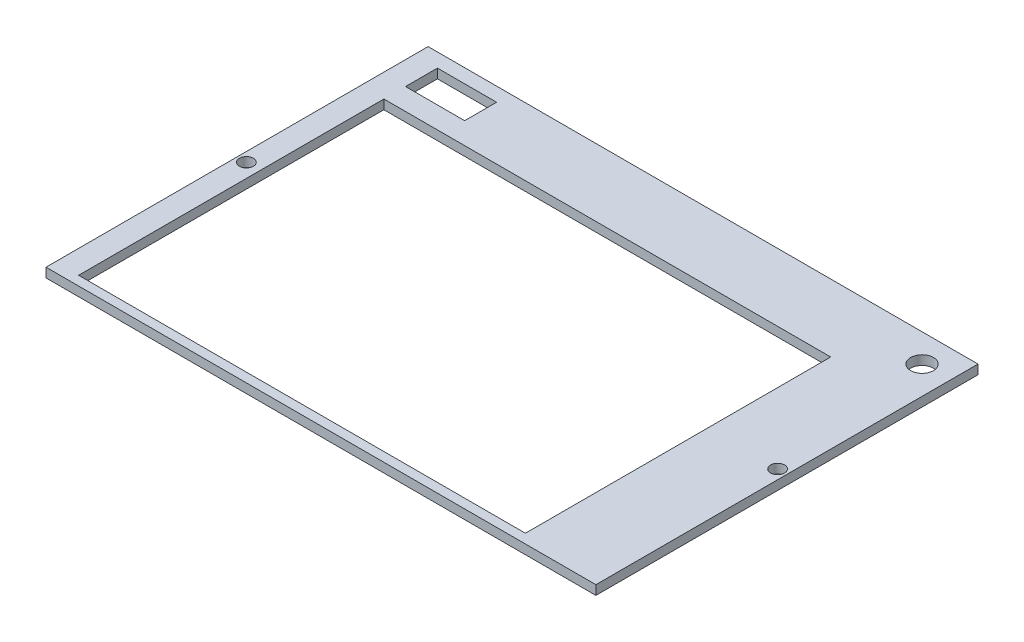
ISO-10303-21;
HEADER;
FILE_DESCRIPTION(('STEP AP214'),'2;1');
FILE_NAME('part.step','',(''),(''),'','','');
FILE_SCHEMA(('AUTOMOTIVE_DESIGN { 1 0 10303 214 1 1 1 1 }'));
ENDSEC;
DATA;
#1=APPLICATION_CONTEXT('core data for automotive mechanical design processes');
#2=APPLICATION_PROTOCOL_DEFINITION('international standard','automotive_design',2000,#1);
#3=PRODUCT_CONTEXT('',#1,'mechanical');
#4=PRODUCT('Part','Part','',(#3));
#5=PRODUCT_RELATED_PRODUCT_CATEGORY('part','',(#4));
#6=PRODUCT_DEFINITION_FORMATION('','',#4);
#7=PRODUCT_DEFINITION_CONTEXT('part definition',#1,'design');
#8=PRODUCT_DEFINITION('design','',#6,#7);
#9=PRODUCT_DEFINITION_SHAPE('','',#8);
#10=(LENGTH_UNIT() NAMED_UNIT(*) SI_UNIT(.MILLI.,.METRE.));
#11=(NAMED_UNIT(*) PLANE_ANGLE_UNIT() SI_UNIT($,.RADIAN.));
#12=(NAMED_UNIT(*) SI_UNIT($,.STERADIAN.) SOLID_ANGLE_UNIT());
#13=UNCERTAINTY_MEASURE_WITH_UNIT(LENGTH_MEASURE(1.E-05),#10,'distance_accuracy_value','');
#14=(GEOMETRIC_REPRESENTATION_CONTEXT(3) GLOBAL_UNCERTAINTY_ASSIGNED_CONTEXT((#13)) GLOBAL_UNIT_ASSIGNED_CONTEXT((#10,
#11,#12)) REPRESENTATION_CONTEXT('',''));
#15=CARTESIAN_POINT('',(0.,0.,0.));
#16=DIRECTION('',(0.,0.,1.));
#17=DIRECTION('',(1.,0.,0.));
#18=AXIS2_PLACEMENT_3D('',#15,#16,#17);
#19=CARTESIAN_POINT('',(59.,2.,41.));
#20=DIRECTION('',(-1.,0.,0.));
#21=DIRECTION('',(0.,0.,1.));
#22=AXIS2_PLACEMENT_3D('',#19,#20,#21);
#23=PLANE('',#22);
#24=DIRECTION('',(0.,0.,-1.));
#25=VECTOR('',#24,1.);
#26=CARTESIAN_POINT('',(59.,0.,41.));
#27=LINE('',#26,#25);
#28=CARTESIAN_POINT('',(59.,0.,41.));
#29=VERTEX_POINT('',#28);
#30=CARTESIAN_POINT('',(59.,0.,-41.));
#31=VERTEX_POINT('',#30);
#32=EDGE_CURVE('E215',#29,#31,#27,.T.);
#33=ORIENTED_EDGE('',*,*,#32,.T.);
#34=DIRECTION('',(0.,-1.,0.));
#35=VECTOR('',#34,1.);
#36=CARTESIAN_POINT('',(59.,2.,-41.));
#37=LINE('',#36,#35);
#38=CARTESIAN_POINT('',(59.,2.,-41.));
#39=VERTEX_POINT('',#38);
#40=EDGE_CURVE('E238',#39,#31,#37,.T.);
#41=ORIENTED_EDGE('',*,*,#40,.F.);
#42=DIRECTION('',(0.,0.,-1.));
#43=VECTOR('',#42,1.);
#44=CARTESIAN_POINT('',(59.,2.,41.));
#45=LINE('',#44,#43);
#46=CARTESIAN_POINT('',(59.,2.,41.));
#47=VERTEX_POINT('',#46);
#48=EDGE_CURVE('E200',#47,#39,#45,.T.);
#49=ORIENTED_EDGE('',*,*,#48,.F.);
#50=DIRECTION('',(0.,-1.,0.));
#51=VECTOR('',#50,1.);
#52=CARTESIAN_POINT('',(59.,2.,41.));
#53=LINE('',#52,#51);
#54=EDGE_CURVE('E214',#47,#29,#53,.T.);
#55=ORIENTED_EDGE('',*,*,#54,.T.);
#56=EDGE_LOOP('',(#33,#41,#49,#55));
#57=FACE_BOUND('',#56,.T.);
#58=ADVANCED_FACE('F39',(#57),#23,.F.);
#59=CARTESIAN_POINT('',(-59.,2.,-41.));
#60=DIRECTION('',(0.,0.,1.));
#61=DIRECTION('',(1.,0.,0.));
#62=AXIS2_PLACEMENT_3D('',#59,#60,#61);
#63=PLANE('',#62);
#64=DIRECTION('',(-1.,0.,0.));
#65=VECTOR('',#64,1.);
#66=CARTESIAN_POINT('',(-59.,0.,-41.));
#67=LINE('',#66,#65);
#68=CARTESIAN_POINT('',(-59.,0.,-41.));
#69=VERTEX_POINT('',#68);
#70=EDGE_CURVE('E219',#31,#69,#67,.T.);
#71=ORIENTED_EDGE('',*,*,#70,.T.);
#72=DIRECTION('',(0.,-1.,0.));
#73=VECTOR('',#72,1.);
#74=CARTESIAN_POINT('',(-59.,2.,-41.));
#75=LINE('',#74,#73);
#76=CARTESIAN_POINT('',(-59.,2.,-41.));
#77=VERTEX_POINT('',#76);
#78=EDGE_CURVE('E234',#77,#69,#75,.T.);
#79=ORIENTED_EDGE('',*,*,#78,.F.);
#80=DIRECTION('',(-1.,0.,0.));
#81=VECTOR('',#80,1.);
#82=CARTESIAN_POINT('',(-59.,2.,-41.));
#83=LINE('',#82,#81);
#84=EDGE_CURVE('E204',#39,#77,#83,.T.);
#85=ORIENTED_EDGE('',*,*,#84,.F.);
#86=ORIENTED_EDGE('',*,*,#40,.T.);
#87=EDGE_LOOP('',(#71,#79,#85,#86));
#88=FACE_BOUND('',#87,.T.);
#89=ADVANCED_FACE('F303',(#88),#63,.F.);
#90=CARTESIAN_POINT('',(-59.,2.,41.));
#91=DIRECTION('',(1.,0.,0.));
#92=DIRECTION('',(0.,0.,-1.));
#93=AXIS2_PLACEMENT_3D('',#90,#91,#92);
#94=PLANE('',#93);
#95=DIRECTION('',(0.,0.,1.));
#96=VECTOR('',#95,1.);
#97=CARTESIAN_POINT('',(-59.,0.,41.));
#98=LINE('',#97,#96);
#99=CARTESIAN_POINT('',(-59.,0.,41.));
#100=VERTEX_POINT('',#99);
#101=EDGE_CURVE('E222',#69,#100,#98,.T.);
#102=ORIENTED_EDGE('',*,*,#101,.T.);
#103=DIRECTION('',(0.,-1.,0.));
#104=VECTOR('',#103,1.);
#105=CARTESIAN_POINT('',(-59.,2.,41.));
#106=LINE('',#105,#104);
#107=CARTESIAN_POINT('',(-59.,2.,41.));
#108=VERTEX_POINT('',#107);
#109=EDGE_CURVE('E230',#108,#100,#106,.T.);
#110=ORIENTED_EDGE('',*,*,#109,.F.);
#111=DIRECTION('',(0.,0.,1.));
#112=VECTOR('',#111,1.);
#113=CARTESIAN_POINT('',(-59.,2.,41.));
#114=LINE('',#113,#112);
#115=EDGE_CURVE('E208',#77,#108,#114,.T.);
#116=ORIENTED_EDGE('',*,*,#115,.F.);
#117=ORIENTED_EDGE('',*,*,#78,.T.);
#118=EDGE_LOOP('',(#102,#110,#116,#117));
#119=FACE_BOUND('',#118,.T.);
#120=ADVANCED_FACE('F298',(#119),#94,.F.);
#121=CARTESIAN_POINT('',(-59.,2.,41.));
#122=DIRECTION('',(0.,0.,-1.));
#123=DIRECTION('',(-1.,0.,0.));
#124=AXIS2_PLACEMENT_3D('',#121,#122,#123);
#125=PLANE('',#124);
#126=DIRECTION('',(1.,0.,0.));
#127=VECTOR('',#126,1.);
#128=CARTESIAN_POINT('',(-59.,0.,41.));
#129=LINE('',#128,#127);
#130=EDGE_CURVE('E205',#100,#29,#129,.T.);
#131=ORIENTED_EDGE('',*,*,#130,.T.);
#132=ORIENTED_EDGE('',*,*,#54,.F.);
#133=DIRECTION('',(1.,0.,0.));
#134=VECTOR('',#133,1.);
#135=CARTESIAN_POINT('',(-59.,2.,41.));
#136=LINE('',#135,#134);
#137=EDGE_CURVE('E211',#108,#47,#136,.T.);
#138=ORIENTED_EDGE('',*,*,#137,.F.);
#139=ORIENTED_EDGE('',*,*,#109,.T.);
#140=EDGE_LOOP('',(#131,#132,#138,#139));
#141=FACE_BOUND('',#140,.T.);
#142=ADVANCED_FACE('F288',(#141),#125,.F.);
#143=CARTESIAN_POINT('',(0.,2.,0.));
#144=DIRECTION('',(0.,-1.,0.));
#145=DIRECTION('',(0.,0.,-1.));
#146=AXIS2_PLACEMENT_3D('',#143,#144,#145);
#147=PLANE('',#146);
#148=CARTESIAN_POINT('',(57.,2.,0.));
#149=DIRECTION('',(0.,1.,0.));
#150=DIRECTION('',(0.,0.,1.));
#151=AXIS2_PLACEMENT_3D('',#148,#149,#150);
#152=CIRCLE('',#151,1.5);
#153=CARTESIAN_POINT('',(57.,2.,1.5));
#154=VERTEX_POINT('',#153);
#155=EDGE_CURVE('E267',#154,#154,#152,.T.);
#156=ORIENTED_EDGE('',*,*,#155,.F.);
#157=EDGE_LOOP('',(#156));
#158=FACE_BOUND('',#157,.T.);
#159=CARTESIAN_POINT('',(-57.,2.,0.));
#160=DIRECTION('',(0.,1.,0.));
#161=DIRECTION('',(0.,0.,1.));
#162=AXIS2_PLACEMENT_3D('',#159,#160,#161);
#163=CIRCLE('',#162,1.5);
#164=CARTESIAN_POINT('',(-57.,2.,1.5));
#165=VERTEX_POINT('',#164);
#166=EDGE_CURVE('E274',#165,#165,#163,.T.);
#167=ORIENTED_EDGE('',*,*,#166,.F.);
#168=EDGE_LOOP('',(#167));
#169=FACE_BOUND('',#168,.T.);
#170=DIRECTION('',(1.,0.,0.));
#171=VECTOR('',#170,1.);
#172=CARTESIAN_POINT('',(-54.,2.,39.));
#173=LINE('',#172,#171);
#174=CARTESIAN_POINT('',(-54.,2.,39.));
#175=VERTEX_POINT('',#174);
#176=CARTESIAN_POINT('',(41.88,2.,39.));
#177=VERTEX_POINT('',#176);
#178=EDGE_CURVE('E147',#175,#177,#173,.T.);
#179=ORIENTED_EDGE('',*,*,#178,.F.);
#180=DIRECTION('',(0.,0.,1.));
#181=VECTOR('',#180,1.);
#182=CARTESIAN_POINT('',(-54.,2.,39.));
#183=LINE('',#182,#181);
#184=CARTESIAN_POINT('',(-54.,2.,-26.51));
#185=VERTEX_POINT('',#184);
#186=EDGE_CURVE('E56',#185,#175,#183,.T.);
#187=ORIENTED_EDGE('',*,*,#186,.F.);
#188=DIRECTION('',(-1.,0.,0.));
#189=VECTOR('',#188,1.);
#190=CARTESIAN_POINT('',(-54.,2.,-26.51));
#191=LINE('',#190,#189);
#192=CARTESIAN_POINT('',(41.88,2.,-26.51));
#193=VERTEX_POINT('',#192);
#194=EDGE_CURVE('E155',#193,#185,#191,.T.);
#195=ORIENTED_EDGE('',*,*,#194,.F.);
#196=DIRECTION('',(0.,0.,-1.));
#197=VECTOR('',#196,1.);
#198=CARTESIAN_POINT('',(41.88,2.,39.));
#199=LINE('',#198,#197);
#200=EDGE_CURVE('E136',#177,#193,#199,.T.);
#201=ORIENTED_EDGE('',*,*,#200,.F.);
#202=EDGE_LOOP('',(#179,#187,#195,#201));
#203=FACE_BOUND('',#202,.T.);
#204=DIRECTION('',(1.,0.,0.));
#205=VECTOR('',#204,1.);
#206=CARTESIAN_POINT('',(-54.,2.,-31.15));
#207=LINE('',#206,#205);
#208=CARTESIAN_POINT('',(-54.,2.,-31.15));
#209=VERTEX_POINT('',#208);
#210=CARTESIAN_POINT('',(-41.31,2.,-31.15));
#211=VERTEX_POINT('',#210);
#212=EDGE_CURVE('E172',#209,#211,#207,.T.);
#213=ORIENTED_EDGE('',*,*,#212,.F.);
#214=DIRECTION('',(0.,0.,1.));
#215=VECTOR('',#214,1.);
#216=CARTESIAN_POINT('',(-54.,2.,-38.));
#217=LINE('',#216,#215);
#218=CARTESIAN_POINT('',(-54.,2.,-38.));
#219=VERTEX_POINT('',#218);
#220=EDGE_CURVE('E64',#219,#209,#217,.T.);
#221=ORIENTED_EDGE('',*,*,#220,.F.);
#222=DIRECTION('',(-1.,0.,0.));
#223=VECTOR('',#222,1.);
#224=CARTESIAN_POINT('',(-54.,2.,-38.));
#225=LINE('',#224,#223);
#226=CARTESIAN_POINT('',(-41.31,2.,-38.));
#227=VERTEX_POINT('',#226);
#228=EDGE_CURVE('E181',#227,#219,#225,.T.);
#229=ORIENTED_EDGE('',*,*,#228,.F.);
#230=DIRECTION('',(0.,0.,-1.));
#231=VECTOR('',#230,1.);
#232=CARTESIAN_POINT('',(-41.31,2.,-38.));
#233=LINE('',#232,#231);
#234=EDGE_CURVE('E177',#211,#227,#233,.T.);
#235=ORIENTED_EDGE('',*,*,#234,.F.);
#236=EDGE_LOOP('',(#213,#221,#229,#235));
#237=FACE_BOUND('',#236,.T.);
#238=CARTESIAN_POINT('',(53.,2.,-35.));
#239=DIRECTION('',(0.,1.,0.));
#240=DIRECTION('',(0.,0.,1.));
#241=AXIS2_PLACEMENT_3D('',#238,#239,#240);
#242=CIRCLE('',#241,2.45);
#243=CARTESIAN_POINT('',(53.,2.,-32.55));
#244=VERTEX_POINT('',#243);
#245=EDGE_CURVE('E173',#244,#244,#242,.T.);
#246=ORIENTED_EDGE('',*,*,#245,.F.);
#247=EDGE_LOOP('',(#246));
#248=FACE_BOUND('',#247,.T.);
#249=ORIENTED_EDGE('',*,*,#48,.T.);
#250=ORIENTED_EDGE('',*,*,#84,.T.);
#251=ORIENTED_EDGE('',*,*,#115,.T.);
#252=ORIENTED_EDGE('',*,*,#137,.T.);
#253=EDGE_LOOP('',(#249,#250,#251,#252));
#254=FACE_BOUND('',#253,.T.);
#255=ADVANCED_FACE('F152',(#158,#169,#203,#237,#248,#254),#147,.F.);
#256=CARTESIAN_POINT('',(0.,0.,0.));
#257=DIRECTION('',(0.,-1.,0.));
#258=DIRECTION('',(0.,0.,-1.));
#259=AXIS2_PLACEMENT_3D('',#256,#257,#258);
#260=PLANE('',#259);
#261=CARTESIAN_POINT('',(57.,0.,0.));
#262=DIRECTION('',(0.,-1.,0.));
#263=DIRECTION('',(0.,0.,-1.));
#264=AXIS2_PLACEMENT_3D('',#261,#262,#263);
#265=CIRCLE('',#264,1.5);
#266=CARTESIAN_POINT('',(57.,0.,-1.5));
#267=VERTEX_POINT('',#266);
#268=EDGE_CURVE('E42',#267,#267,#265,.T.);
#269=ORIENTED_EDGE('',*,*,#268,.F.);
#270=EDGE_LOOP('',(#269));
#271=FACE_BOUND('',#270,.T.);
#272=CARTESIAN_POINT('',(-57.,0.,0.));
#273=DIRECTION('',(0.,-1.,0.));
#274=DIRECTION('',(0.,0.,-1.));
#275=AXIS2_PLACEMENT_3D('',#272,#273,#274);
#276=CIRCLE('',#275,1.5);
#277=CARTESIAN_POINT('',(-57.,0.,-1.5));
#278=VERTEX_POINT('',#277);
#279=EDGE_CURVE('E264',#278,#278,#276,.T.);
#280=ORIENTED_EDGE('',*,*,#279,.F.);
#281=EDGE_LOOP('',(#280));
#282=FACE_BOUND('',#281,.T.);
#283=DIRECTION('',(0.,0.,-1.));
#284=VECTOR('',#283,1.);
#285=CARTESIAN_POINT('',(-54.,0.,0.));
#286=LINE('',#285,#284);
#287=CARTESIAN_POINT('',(-54.,0.,39.));
#288=VERTEX_POINT('',#287);
#289=CARTESIAN_POINT('',(-54.,0.,-26.51));
#290=VERTEX_POINT('',#289);
#291=EDGE_CURVE('E11',#288,#290,#286,.T.);
#292=ORIENTED_EDGE('',*,*,#291,.F.);
#293=DIRECTION('',(-1.,0.,0.));
#294=VECTOR('',#293,1.);
#295=CARTESIAN_POINT('',(0.,0.,39.));
#296=LINE('',#295,#294);
#297=CARTESIAN_POINT('',(41.88,0.,39.));
#298=VERTEX_POINT('',#297);
#299=EDGE_CURVE('E258',#298,#288,#296,.T.);
#300=ORIENTED_EDGE('',*,*,#299,.F.);
#301=DIRECTION('',(0.,0.,1.));
#302=VECTOR('',#301,1.);
#303=CARTESIAN_POINT('',(41.88,0.,0.));
#304=LINE('',#303,#302);
#305=CARTESIAN_POINT('',(41.88,0.,-26.51));
#306=VERTEX_POINT('',#305);
#307=EDGE_CURVE('E139',#306,#298,#304,.T.);
#308=ORIENTED_EDGE('',*,*,#307,.F.);
#309=DIRECTION('',(1.,0.,0.));
#310=VECTOR('',#309,1.);
#311=CARTESIAN_POINT('',(0.,0.,-26.51));
#312=LINE('',#311,#310);
#313=EDGE_CURVE('E48',#290,#306,#312,.T.);
#314=ORIENTED_EDGE('',*,*,#313,.F.);
#315=EDGE_LOOP('',(#292,#300,#308,#314));
#316=FACE_BOUND('',#315,.T.);
#317=DIRECTION('',(0.,0.,-1.));
#318=VECTOR('',#317,1.);
#319=CARTESIAN_POINT('',(-54.,0.,0.));
#320=LINE('',#319,#318);
#321=CARTESIAN_POINT('',(-54.,0.,-31.15));
#322=VERTEX_POINT('',#321);
#323=CARTESIAN_POINT('',(-54.,0.,-38.));
#324=VERTEX_POINT('',#323);
#325=EDGE_CURVE('E255',#322,#324,#320,.T.);
#326=ORIENTED_EDGE('',*,*,#325,.F.);
#327=DIRECTION('',(-1.,0.,0.));
#328=VECTOR('',#327,1.);
#329=CARTESIAN_POINT('',(0.,0.,-31.15));
#330=LINE('',#329,#328);
#331=CARTESIAN_POINT('',(-41.31,0.,-31.15));
#332=VERTEX_POINT('',#331);
#333=EDGE_CURVE('E242',#332,#322,#330,.T.);
#334=ORIENTED_EDGE('',*,*,#333,.F.);
#335=DIRECTION('',(0.,0.,1.));
#336=VECTOR('',#335,1.);
#337=CARTESIAN_POINT('',(-41.31,0.,0.));
#338=LINE('',#337,#336);
#339=CARTESIAN_POINT('',(-41.31,0.,-38.));
#340=VERTEX_POINT('',#339);
#341=EDGE_CURVE('E248',#340,#332,#338,.T.);
#342=ORIENTED_EDGE('',*,*,#341,.F.);
#343=DIRECTION('',(1.,0.,0.));
#344=VECTOR('',#343,1.);
#345=CARTESIAN_POINT('',(0.,0.,-38.));
#346=LINE('',#345,#344);
#347=EDGE_CURVE('E252',#324,#340,#346,.T.);
#348=ORIENTED_EDGE('',*,*,#347,.F.);
#349=EDGE_LOOP('',(#326,#334,#342,#348));
#350=FACE_BOUND('',#349,.T.);
#351=CARTESIAN_POINT('',(53.,0.,-35.));
#352=DIRECTION('',(0.,-1.,0.));
#353=DIRECTION('',(0.,0.,-1.));
#354=AXIS2_PLACEMENT_3D('',#351,#352,#353);
#355=CIRCLE('',#354,2.45);
#356=CARTESIAN_POINT('',(53.,0.,-37.45));
#357=VERTEX_POINT('',#356);
#358=EDGE_CURVE('E165',#357,#357,#355,.T.);
#359=ORIENTED_EDGE('',*,*,#358,.F.);
#360=EDGE_LOOP('',(#359));
#361=FACE_BOUND('',#360,.T.);
#362=ORIENTED_EDGE('',*,*,#32,.F.);
#363=ORIENTED_EDGE('',*,*,#130,.F.);
#364=ORIENTED_EDGE('',*,*,#101,.F.);
#365=ORIENTED_EDGE('',*,*,#70,.F.);
#366=EDGE_LOOP('',(#362,#363,#364,#365));
#367=FACE_BOUND('',#366,.T.);
#368=ADVANCED_FACE('F287',(#271,#282,#316,#350,#361,#367),#260,.T.);
#369=CARTESIAN_POINT('',(53.,-8.,-35.));
#370=DIRECTION('',(0.,1.,0.));
#371=DIRECTION('',(0.,0.,1.));
#372=AXIS2_PLACEMENT_3D('',#369,#370,#371);
#373=CYLINDRICAL_SURFACE('',#372,2.45);
#374=ORIENTED_EDGE('',*,*,#358,.T.);
#375=EDGE_LOOP('',(#374));
#376=FACE_BOUND('',#375,.T.);
#377=ORIENTED_EDGE('',*,*,#245,.T.);
#378=EDGE_LOOP('',(#377));
#379=FACE_BOUND('',#378,.T.);
#380=ADVANCED_FACE('F295',(#376,#379),#373,.F.);
#381=CARTESIAN_POINT('',(-54.,-8.,-38.));
#382=DIRECTION('',(-1.,0.,0.));
#383=DIRECTION('',(0.,0.,1.));
#384=AXIS2_PLACEMENT_3D('',#381,#382,#383);
#385=PLANE('',#384);
#386=ORIENTED_EDGE('',*,*,#325,.T.);
#387=DIRECTION('',(0.,1.,0.));
#388=VECTOR('',#387,1.);
#389=CARTESIAN_POINT('',(-54.,-8.,-38.));
#390=LINE('',#389,#388);
#391=EDGE_CURVE('E186',#324,#219,#390,.T.);
#392=ORIENTED_EDGE('',*,*,#391,.T.);
#393=ORIENTED_EDGE('',*,*,#220,.T.);
#394=DIRECTION('',(0.,1.,0.));
#395=VECTOR('',#394,1.);
#396=CARTESIAN_POINT('',(-54.,-8.,-31.15));
#397=LINE('',#396,#395);
#398=EDGE_CURVE('E185',#322,#209,#397,.T.);
#399=ORIENTED_EDGE('',*,*,#398,.F.);
#400=EDGE_LOOP('',(#386,#392,#393,#399));
#401=FACE_BOUND('',#400,.T.);
#402=ADVANCED_FACE('F342',(#401),#385,.F.);
#403=CARTESIAN_POINT('',(-54.,-8.,-38.));
#404=DIRECTION('',(0.,0.,-1.));
#405=DIRECTION('',(-1.,0.,0.));
#406=AXIS2_PLACEMENT_3D('',#403,#404,#405);
#407=PLANE('',#406);
#408=ORIENTED_EDGE('',*,*,#347,.T.);
#409=DIRECTION('',(0.,1.,0.));
#410=VECTOR('',#409,1.);
#411=CARTESIAN_POINT('',(-41.31,-8.,-38.));
#412=LINE('',#411,#410);
#413=EDGE_CURVE('E189',#340,#227,#412,.T.);
#414=ORIENTED_EDGE('',*,*,#413,.T.);
#415=ORIENTED_EDGE('',*,*,#228,.T.);
#416=ORIENTED_EDGE('',*,*,#391,.F.);
#417=EDGE_LOOP('',(#408,#414,#415,#416));
#418=FACE_BOUND('',#417,.T.);
#419=ADVANCED_FACE('F352',(#418),#407,.F.);
#420=CARTESIAN_POINT('',(-41.31,-8.,-38.));
#421=DIRECTION('',(1.,0.,0.));
#422=DIRECTION('',(0.,0.,-1.));
#423=AXIS2_PLACEMENT_3D('',#420,#421,#422);
#424=PLANE('',#423);
#425=ORIENTED_EDGE('',*,*,#341,.T.);
#426=DIRECTION('',(0.,1.,0.));
#427=VECTOR('',#426,1.);
#428=CARTESIAN_POINT('',(-41.31,-8.,-31.15));
#429=LINE('',#428,#427);
#430=EDGE_CURVE('E192',#332,#211,#429,.T.);
#431=ORIENTED_EDGE('',*,*,#430,.T.);
#432=ORIENTED_EDGE('',*,*,#234,.T.);
#433=ORIENTED_EDGE('',*,*,#413,.F.);
#434=EDGE_LOOP('',(#425,#431,#432,#433));
#435=FACE_BOUND('',#434,.T.);
#436=ADVANCED_FACE('F361',(#435),#424,.F.);
#437=CARTESIAN_POINT('',(-54.,-8.,-31.15));
#438=DIRECTION('',(0.,0.,1.));
#439=DIRECTION('',(1.,0.,0.));
#440=AXIS2_PLACEMENT_3D('',#437,#438,#439);
#441=PLANE('',#440);
#442=ORIENTED_EDGE('',*,*,#333,.T.);
#443=ORIENTED_EDGE('',*,*,#398,.T.);
#444=ORIENTED_EDGE('',*,*,#212,.T.);
#445=ORIENTED_EDGE('',*,*,#430,.F.);
#446=EDGE_LOOP('',(#442,#443,#444,#445));
#447=FACE_BOUND('',#446,.T.);
#448=ADVANCED_FACE('F371',(#447),#441,.F.);
#449=CARTESIAN_POINT('',(-54.,-8.,39.));
#450=DIRECTION('',(-1.,0.,0.));
#451=DIRECTION('',(0.,0.,1.));
#452=AXIS2_PLACEMENT_3D('',#449,#450,#451);
#453=PLANE('',#452);
#454=ORIENTED_EDGE('',*,*,#291,.T.);
#455=DIRECTION('',(0.,1.,0.));
#456=VECTOR('',#455,1.);
#457=CARTESIAN_POINT('',(-54.,-8.,-26.51));
#458=LINE('',#457,#456);
#459=EDGE_CURVE('E162',#290,#185,#458,.T.);
#460=ORIENTED_EDGE('',*,*,#459,.T.);
#461=ORIENTED_EDGE('',*,*,#186,.T.);
#462=DIRECTION('',(0.,1.,0.));
#463=VECTOR('',#462,1.);
#464=CARTESIAN_POINT('',(-54.,-8.,39.));
#465=LINE('',#464,#463);
#466=EDGE_CURVE('E144',#288,#175,#465,.T.);
#467=ORIENTED_EDGE('',*,*,#466,.F.);
#468=EDGE_LOOP('',(#454,#460,#461,#467));
#469=FACE_BOUND('',#468,.T.);
#470=ADVANCED_FACE('F381',(#469),#453,.F.);
#471=CARTESIAN_POINT('',(-54.,-8.,-26.51));
#472=DIRECTION('',(0.,0.,-1.));
#473=DIRECTION('',(-1.,0.,0.));
#474=AXIS2_PLACEMENT_3D('',#471,#472,#473);
#475=PLANE('',#474);
#476=ORIENTED_EDGE('',*,*,#313,.T.);
#477=DIRECTION('',(0.,1.,0.));
#478=VECTOR('',#477,1.);
#479=CARTESIAN_POINT('',(41.88,-8.,-26.51));
#480=LINE('',#479,#478);
#481=EDGE_CURVE('E143',#306,#193,#480,.T.);
#482=ORIENTED_EDGE('',*,*,#481,.T.);
#483=ORIENTED_EDGE('',*,*,#194,.T.);
#484=ORIENTED_EDGE('',*,*,#459,.F.);
#485=EDGE_LOOP('',(#476,#482,#483,#484));
#486=FACE_BOUND('',#485,.T.);
#487=ADVANCED_FACE('F391',(#486),#475,.F.);
#488=CARTESIAN_POINT('',(41.88,-8.,39.));
#489=DIRECTION('',(1.,0.,0.));
#490=DIRECTION('',(0.,0.,-1.));
#491=AXIS2_PLACEMENT_3D('',#488,#489,#490);
#492=PLANE('',#491);
#493=ORIENTED_EDGE('',*,*,#307,.T.);
#494=DIRECTION('',(0.,1.,0.));
#495=VECTOR('',#494,1.);
#496=CARTESIAN_POINT('',(41.88,-8.,39.));
#497=LINE('',#496,#495);
#498=EDGE_CURVE('E131',#298,#177,#497,.T.);
#499=ORIENTED_EDGE('',*,*,#498,.T.);
#500=ORIENTED_EDGE('',*,*,#200,.T.);
#501=ORIENTED_EDGE('',*,*,#481,.F.);
#502=EDGE_LOOP('',(#493,#499,#500,#501));
#503=FACE_BOUND('',#502,.T.);
#504=ADVANCED_FACE('F133',(#503),#492,.F.);
#505=CARTESIAN_POINT('',(-54.,-8.,39.));
#506=DIRECTION('',(0.,0.,1.));
#507=DIRECTION('',(1.,0.,0.));
#508=AXIS2_PLACEMENT_3D('',#505,#506,#507);
#509=PLANE('',#508);
#510=ORIENTED_EDGE('',*,*,#299,.T.);
#511=ORIENTED_EDGE('',*,*,#466,.T.);
#512=ORIENTED_EDGE('',*,*,#178,.T.);
#513=ORIENTED_EDGE('',*,*,#498,.F.);
#514=EDGE_LOOP('',(#510,#511,#512,#513));
#515=FACE_BOUND('',#514,.T.);
#516=ADVANCED_FACE('F148',(#515),#509,.F.);
#517=CARTESIAN_POINT('',(-57.,-8.,0.));
#518=DIRECTION('',(0.,1.,0.));
#519=DIRECTION('',(0.,0.,1.));
#520=AXIS2_PLACEMENT_3D('',#517,#518,#519);
#521=CYLINDRICAL_SURFACE('',#520,1.5);
#522=ORIENTED_EDGE('',*,*,#279,.T.);
#523=EDGE_LOOP('',(#522));
#524=FACE_BOUND('',#523,.T.);
#525=ORIENTED_EDGE('',*,*,#166,.T.);
#526=EDGE_LOOP('',(#525));
#527=FACE_BOUND('',#526,.T.);
#528=ADVANCED_FACE('F284',(#524,#527),#521,.F.);
#529=CARTESIAN_POINT('',(57.,-8.,0.));
#530=DIRECTION('',(0.,1.,0.));
#531=DIRECTION('',(0.,0.,1.));
#532=AXIS2_PLACEMENT_3D('',#529,#530,#531);
#533=CYLINDRICAL_SURFACE('',#532,1.5);
#534=ORIENTED_EDGE('',*,*,#268,.T.);
#535=EDGE_LOOP('',(#534));
#536=FACE_BOUND('',#535,.T.);
#537=ORIENTED_EDGE('',*,*,#155,.T.);
#538=EDGE_LOOP('',(#537));
#539=FACE_BOUND('',#538,.T.);
#540=ADVANCED_FACE('F433',(#536,#539),#533,.F.);
#541=CLOSED_SHELL('',(#58,#89,#120,#142,#255,#368,#380,#402,#419,#436,#448,#470,#487,#504,#516,
#528,#540));
#542=MANIFOLD_SOLID_BREP('B2',#541);
#543=ADVANCED_BREP_SHAPE_REPRESENTATION('',(#18,#542),#14);
#544=SHAPE_DEFINITION_REPRESENTATION(#9,#543);
ENDSEC;
END-ISO-10303-21;
